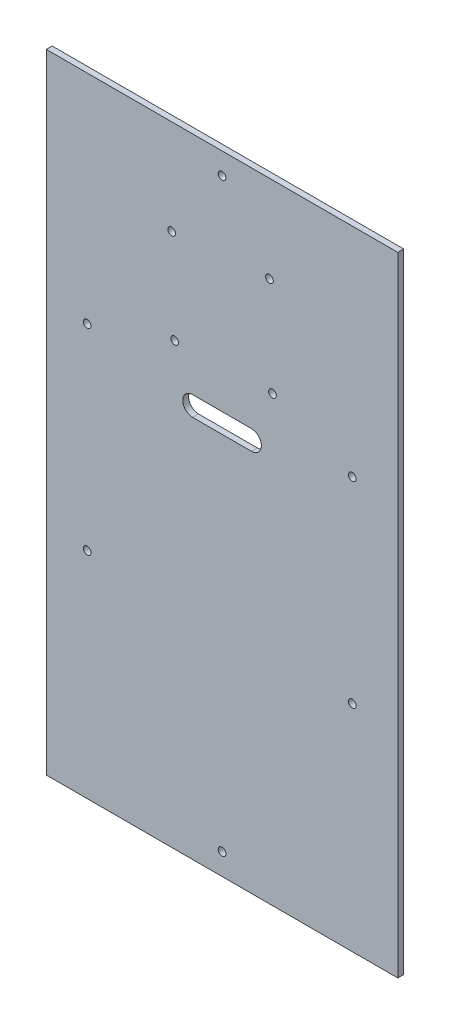
ISO-10303-21;
HEADER;
FILE_DESCRIPTION(('STEP AP214'),'2;1');
FILE_NAME('part.step','',(''),(''),'','','');
FILE_SCHEMA(('AUTOMOTIVE_DESIGN { 1 0 10303 214 1 1 1 1 }'));
ENDSEC;
DATA;
#1=APPLICATION_CONTEXT('core data for automotive mechanical design processes');
#2=APPLICATION_PROTOCOL_DEFINITION('international standard','automotive_design',2000,#1);
#3=PRODUCT_CONTEXT('',#1,'mechanical');
#4=PRODUCT('Part','Part','',(#3));
#5=PRODUCT_RELATED_PRODUCT_CATEGORY('part','',(#4));
#6=PRODUCT_DEFINITION_FORMATION('','',#4);
#7=PRODUCT_DEFINITION_CONTEXT('part definition',#1,'design');
#8=PRODUCT_DEFINITION('design','',#6,#7);
#9=PRODUCT_DEFINITION_SHAPE('','',#8);
#10=(LENGTH_UNIT() NAMED_UNIT(*) SI_UNIT(.MILLI.,.METRE.));
#11=(NAMED_UNIT(*) PLANE_ANGLE_UNIT() SI_UNIT($,.RADIAN.));
#12=(NAMED_UNIT(*) SI_UNIT($,.STERADIAN.) SOLID_ANGLE_UNIT());
#13=UNCERTAINTY_MEASURE_WITH_UNIT(LENGTH_MEASURE(1.E-05),#10,'distance_accuracy_value','');
#14=(GEOMETRIC_REPRESENTATION_CONTEXT(3) GLOBAL_UNCERTAINTY_ASSIGNED_CONTEXT((#13)) GLOBAL_UNIT_ASSIGNED_CONTEXT((#10,
#11,#12)) REPRESENTATION_CONTEXT('',''));
#15=CARTESIAN_POINT('',(0.,0.,0.));
#16=DIRECTION('',(0.,0.,1.));
#17=DIRECTION('',(1.,0.,0.));
#18=AXIS2_PLACEMENT_3D('',#15,#16,#17);
#19=CARTESIAN_POINT('',(-89.5,160.,3.));
#20=DIRECTION('',(1.,0.,0.));
#21=DIRECTION('',(0.,1.,0.));
#22=AXIS2_PLACEMENT_3D('',#19,#20,#21);
#23=PLANE('',#22);
#24=DIRECTION('',(0.,-1.,0.));
#25=VECTOR('',#24,1.);
#26=CARTESIAN_POINT('',(-89.5,160.,0.));
#27=LINE('',#26,#25);
#28=CARTESIAN_POINT('',(-89.5,160.,0.));
#29=VERTEX_POINT('',#28);
#30=CARTESIAN_POINT('',(-89.5,-160.,0.));
#31=VERTEX_POINT('',#30);
#32=EDGE_CURVE('E174',#29,#31,#27,.T.);
#33=ORIENTED_EDGE('',*,*,#32,.T.);
#34=DIRECTION('',(0.,0.,-1.));
#35=VECTOR('',#34,1.);
#36=CARTESIAN_POINT('',(-89.5,-160.,3.));
#37=LINE('',#36,#35);
#38=CARTESIAN_POINT('',(-89.5,-160.,3.));
#39=VERTEX_POINT('',#38);
#40=EDGE_CURVE('E11',#39,#31,#37,.T.);
#41=ORIENTED_EDGE('',*,*,#40,.F.);
#42=DIRECTION('',(0.,-1.,0.));
#43=VECTOR('',#42,1.);
#44=CARTESIAN_POINT('',(-89.5,160.,3.));
#45=LINE('',#44,#43);
#46=CARTESIAN_POINT('',(-89.5,160.,3.));
#47=VERTEX_POINT('',#46);
#48=EDGE_CURVE('E175',#47,#39,#45,.T.);
#49=ORIENTED_EDGE('',*,*,#48,.F.);
#50=DIRECTION('',(0.,0.,-1.));
#51=VECTOR('',#50,1.);
#52=CARTESIAN_POINT('',(-89.5,160.,3.));
#53=LINE('',#52,#51);
#54=EDGE_CURVE('E185',#47,#29,#53,.T.);
#55=ORIENTED_EDGE('',*,*,#54,.T.);
#56=EDGE_LOOP('',(#33,#41,#49,#55));
#57=FACE_BOUND('',#56,.T.);
#58=ADVANCED_FACE('F35',(#57),#23,.F.);
#59=CARTESIAN_POINT('',(-89.5,-160.,3.));
#60=DIRECTION('',(0.,1.,0.));
#61=DIRECTION('',(0.,0.,1.));
#62=AXIS2_PLACEMENT_3D('',#59,#60,#61);
#63=PLANE('',#62);
#64=DIRECTION('',(1.,0.,0.));
#65=VECTOR('',#64,1.);
#66=CARTESIAN_POINT('',(-89.5,-160.,0.));
#67=LINE('',#66,#65);
#68=CARTESIAN_POINT('',(89.5,-160.,0.));
#69=VERTEX_POINT('',#68);
#70=EDGE_CURVE('E188',#31,#69,#67,.T.);
#71=ORIENTED_EDGE('',*,*,#70,.T.);
#72=DIRECTION('',(0.,0.,-1.));
#73=VECTOR('',#72,1.);
#74=CARTESIAN_POINT('',(89.5,-160.,3.));
#75=LINE('',#74,#73);
#76=CARTESIAN_POINT('',(89.5,-160.,3.));
#77=VERTEX_POINT('',#76);
#78=EDGE_CURVE('E42',#77,#69,#75,.T.);
#79=ORIENTED_EDGE('',*,*,#78,.F.);
#80=DIRECTION('',(1.,0.,0.));
#81=VECTOR('',#80,1.);
#82=CARTESIAN_POINT('',(-89.5,-160.,3.));
#83=LINE('',#82,#81);
#84=EDGE_CURVE('E178',#39,#77,#83,.T.);
#85=ORIENTED_EDGE('',*,*,#84,.F.);
#86=ORIENTED_EDGE('',*,*,#40,.T.);
#87=EDGE_LOOP('',(#71,#79,#85,#86));
#88=FACE_BOUND('',#87,.T.);
#89=ADVANCED_FACE('F217',(#88),#63,.F.);
#90=CARTESIAN_POINT('',(89.5,160.,3.));
#91=DIRECTION('',(-1.,0.,0.));
#92=DIRECTION('',(0.,-1.,0.));
#93=AXIS2_PLACEMENT_3D('',#90,#91,#92);
#94=PLANE('',#93);
#95=DIRECTION('',(0.,1.,0.));
#96=VECTOR('',#95,1.);
#97=CARTESIAN_POINT('',(89.5,160.,0.));
#98=LINE('',#97,#96);
#99=CARTESIAN_POINT('',(89.5,160.,0.));
#100=VERTEX_POINT('',#99);
#101=EDGE_CURVE('E190',#69,#100,#98,.T.);
#102=ORIENTED_EDGE('',*,*,#101,.T.);
#103=DIRECTION('',(0.,0.,-1.));
#104=VECTOR('',#103,1.);
#105=CARTESIAN_POINT('',(89.5,160.,3.));
#106=LINE('',#105,#104);
#107=CARTESIAN_POINT('',(89.5,160.,3.));
#108=VERTEX_POINT('',#107);
#109=EDGE_CURVE('E195',#108,#100,#106,.T.);
#110=ORIENTED_EDGE('',*,*,#109,.F.);
#111=DIRECTION('',(0.,1.,0.));
#112=VECTOR('',#111,1.);
#113=CARTESIAN_POINT('',(89.5,160.,3.));
#114=LINE('',#113,#112);
#115=EDGE_CURVE('E181',#77,#108,#114,.T.);
#116=ORIENTED_EDGE('',*,*,#115,.F.);
#117=ORIENTED_EDGE('',*,*,#78,.T.);
#118=EDGE_LOOP('',(#102,#110,#116,#117));
#119=FACE_BOUND('',#118,.T.);
#120=ADVANCED_FACE('F202',(#119),#94,.F.);
#121=CARTESIAN_POINT('',(-89.5,160.,3.));
#122=DIRECTION('',(0.,-1.,0.));
#123=DIRECTION('',(0.,0.,-1.));
#124=AXIS2_PLACEMENT_3D('',#121,#122,#123);
#125=PLANE('',#124);
#126=DIRECTION('',(-1.,0.,0.));
#127=VECTOR('',#126,1.);
#128=CARTESIAN_POINT('',(-89.5,160.,0.));
#129=LINE('',#128,#127);
#130=EDGE_CURVE('E179',#100,#29,#129,.T.);
#131=ORIENTED_EDGE('',*,*,#130,.T.);
#132=ORIENTED_EDGE('',*,*,#54,.F.);
#133=DIRECTION('',(-1.,0.,0.));
#134=VECTOR('',#133,1.);
#135=CARTESIAN_POINT('',(-89.5,160.,3.));
#136=LINE('',#135,#134);
#137=EDGE_CURVE('E183',#108,#47,#136,.T.);
#138=ORIENTED_EDGE('',*,*,#137,.F.);
#139=ORIENTED_EDGE('',*,*,#109,.T.);
#140=EDGE_LOOP('',(#131,#132,#138,#139));
#141=FACE_BOUND('',#140,.T.);
#142=ADVANCED_FACE('F210',(#141),#125,.F.);
#143=CARTESIAN_POINT('',(0.,0.,3.));
#144=DIRECTION('',(0.,0.,1.));
#145=DIRECTION('',(1.,0.,0.));
#146=AXIS2_PLACEMENT_3D('',#143,#144,#145);
#147=PLANE('',#146);
#148=CARTESIAN_POINT('',(-24.1541113062931,64.3179863791884,3.));
#149=DIRECTION('',(0.,0.,1.));
#150=DIRECTION('',(1.,0.,0.));
#151=AXIS2_PLACEMENT_3D('',#148,#149,#150);
#152=CIRCLE('',#151,1.94999999999999);
#153=CARTESIAN_POINT('',(-22.2041113062931,64.3179863791884,3.));
#154=VERTEX_POINT('',#153);
#155=EDGE_CURVE('E291',#154,#154,#152,.T.);
#156=ORIENTED_EDGE('',*,*,#155,.F.);
#157=EDGE_LOOP('',(#156));
#158=FACE_BOUND('',#157,.T.);
#159=CARTESIAN_POINT('',(25.6736027414732,65.8424248902623,3.));
#160=DIRECTION('',(0.,0.,1.));
#161=DIRECTION('',(1.,0.,0.));
#162=AXIS2_PLACEMENT_3D('',#159,#160,#161);
#163=CIRCLE('',#162,1.94999999999999);
#164=CARTESIAN_POINT('',(27.6236027414731,65.8424248902623,3.));
#165=VERTEX_POINT('',#164);
#166=EDGE_CURVE('E293',#165,#165,#163,.T.);
#167=ORIENTED_EDGE('',*,*,#166,.F.);
#168=EDGE_LOOP('',(#167));
#169=FACE_BOUND('',#168,.T.);
#170=CARTESIAN_POINT('',(24.1491642303993,115.670138938028,3.));
#171=DIRECTION('',(0.,0.,1.));
#172=DIRECTION('',(1.,0.,0.));
#173=AXIS2_PLACEMENT_3D('',#170,#171,#172);
#174=CIRCLE('',#173,1.94999999999999);
#175=CARTESIAN_POINT('',(26.0991642303993,115.670138938028,3.));
#176=VERTEX_POINT('',#175);
#177=EDGE_CURVE('E301',#176,#176,#174,.T.);
#178=ORIENTED_EDGE('',*,*,#177,.F.);
#179=EDGE_LOOP('',(#178));
#180=FACE_BOUND('',#179,.T.);
#181=CARTESIAN_POINT('',(-25.6234074167878,111.665831379753,3.));
#182=DIRECTION('',(0.,0.,1.));
#183=DIRECTION('',(1.,0.,0.));
#184=AXIS2_PLACEMENT_3D('',#181,#182,#183);
#185=CIRCLE('',#184,1.94999999999999);
#186=CARTESIAN_POINT('',(-23.6734074167878,111.665831379753,3.));
#187=VERTEX_POINT('',#186);
#188=EDGE_CURVE('E306',#187,#187,#185,.T.);
#189=ORIENTED_EDGE('',*,*,#188,.F.);
#190=EDGE_LOOP('',(#189));
#191=FACE_BOUND('',#190,.T.);
#192=CARTESIAN_POINT('',(-15.,40.,3.));
#193=DIRECTION('',(0.,0.,1.));
#194=DIRECTION('',(1.,0.,0.));
#195=AXIS2_PLACEMENT_3D('',#192,#193,#194);
#196=CIRCLE('',#195,5.);
#197=CARTESIAN_POINT('',(-15.,45.,3.));
#198=VERTEX_POINT('',#197);
#199=CARTESIAN_POINT('',(-15.,35.,3.));
#200=VERTEX_POINT('',#199);
#201=EDGE_CURVE('E49',#198,#200,#196,.T.);
#202=ORIENTED_EDGE('',*,*,#201,.F.);
#203=DIRECTION('',(-1.,0.,0.));
#204=VECTOR('',#203,1.);
#205=CARTESIAN_POINT('',(-15.,45.,3.));
#206=LINE('',#205,#204);
#207=CARTESIAN_POINT('',(15.,45.,3.));
#208=VERTEX_POINT('',#207);
#209=EDGE_CURVE('E117',#208,#198,#206,.T.);
#210=ORIENTED_EDGE('',*,*,#209,.F.);
#211=CARTESIAN_POINT('',(15.,40.,3.));
#212=DIRECTION('',(0.,0.,1.));
#213=DIRECTION('',(1.,0.,0.));
#214=AXIS2_PLACEMENT_3D('',#211,#212,#213);
#215=CIRCLE('',#214,5.);
#216=CARTESIAN_POINT('',(15.,35.,3.));
#217=VERTEX_POINT('',#216);
#218=EDGE_CURVE('E120',#217,#208,#215,.T.);
#219=ORIENTED_EDGE('',*,*,#218,.F.);
#220=DIRECTION('',(1.,0.,0.));
#221=VECTOR('',#220,1.);
#222=CARTESIAN_POINT('',(-15.,35.,3.));
#223=LINE('',#222,#221);
#224=EDGE_CURVE('E129',#200,#217,#223,.T.);
#225=ORIENTED_EDGE('',*,*,#224,.F.);
#226=EDGE_LOOP('',(#202,#210,#219,#225));
#227=FACE_BOUND('',#226,.T.);
#228=CARTESIAN_POINT('',(0.,149.,3.));
#229=DIRECTION('',(0.,0.,1.));
#230=DIRECTION('',(1.,0.,0.));
#231=AXIS2_PLACEMENT_3D('',#228,#229,#230);
#232=CIRCLE('',#231,1.94999999999999);
#233=CARTESIAN_POINT('',(1.94999999999996,149.,3.));
#234=VERTEX_POINT('',#233);
#235=EDGE_CURVE('E135',#234,#234,#232,.T.);
#236=ORIENTED_EDGE('',*,*,#235,.F.);
#237=EDGE_LOOP('',(#236));
#238=FACE_BOUND('',#237,.T.);
#239=CARTESIAN_POINT('',(-68.6899999999997,49.4199999999995,3.));
#240=DIRECTION('',(0.,0.,1.));
#241=DIRECTION('',(1.,0.,0.));
#242=AXIS2_PLACEMENT_3D('',#239,#240,#241);
#243=CIRCLE('',#242,1.94999999999999);
#244=CARTESIAN_POINT('',(-66.7399999999997,49.4199999999995,3.));
#245=VERTEX_POINT('',#244);
#246=EDGE_CURVE('E144',#245,#245,#243,.T.);
#247=ORIENTED_EDGE('',*,*,#246,.F.);
#248=EDGE_LOOP('',(#247));
#249=FACE_BOUND('',#248,.T.);
#250=CARTESIAN_POINT('',(66.31,49.4200000000004,3.));
#251=DIRECTION('',(0.,0.,1.));
#252=DIRECTION('',(1.,0.,0.));
#253=AXIS2_PLACEMENT_3D('',#250,#251,#252);
#254=CIRCLE('',#253,1.94999999999999);
#255=CARTESIAN_POINT('',(68.26,49.4200000000004,3.));
#256=VERTEX_POINT('',#255);
#257=EDGE_CURVE('E150',#256,#256,#254,.T.);
#258=ORIENTED_EDGE('',*,*,#257,.F.);
#259=EDGE_LOOP('',(#258));
#260=FACE_BOUND('',#259,.T.);
#261=CARTESIAN_POINT('',(-68.6899999999987,-50.580000000001,3.));
#262=DIRECTION('',(0.,0.,1.));
#263=DIRECTION('',(1.,0.,0.));
#264=AXIS2_PLACEMENT_3D('',#261,#262,#263);
#265=CIRCLE('',#264,1.94999999999999);
#266=CARTESIAN_POINT('',(-66.7399999999987,-50.580000000001,3.));
#267=VERTEX_POINT('',#266);
#268=EDGE_CURVE('E156',#267,#267,#265,.T.);
#269=ORIENTED_EDGE('',*,*,#268,.F.);
#270=EDGE_LOOP('',(#269));
#271=FACE_BOUND('',#270,.T.);
#272=CARTESIAN_POINT('',(0.,-149.,3.));
#273=DIRECTION('',(0.,0.,1.));
#274=DIRECTION('',(1.,0.,0.));
#275=AXIS2_PLACEMENT_3D('',#272,#273,#274);
#276=CIRCLE('',#275,1.94999999999999);
#277=CARTESIAN_POINT('',(1.94999999999996,-149.,3.));
#278=VERTEX_POINT('',#277);
#279=EDGE_CURVE('E162',#278,#278,#276,.T.);
#280=ORIENTED_EDGE('',*,*,#279,.F.);
#281=EDGE_LOOP('',(#280));
#282=FACE_BOUND('',#281,.T.);
#283=CARTESIAN_POINT('',(66.310000000001,-50.58,3.));
#284=DIRECTION('',(0.,0.,1.));
#285=DIRECTION('',(1.,0.,0.));
#286=AXIS2_PLACEMENT_3D('',#283,#284,#285);
#287=CIRCLE('',#286,1.94999999999999);
#288=CARTESIAN_POINT('',(68.260000000001,-50.58,3.));
#289=VERTEX_POINT('',#288);
#290=EDGE_CURVE('E168',#289,#289,#287,.T.);
#291=ORIENTED_EDGE('',*,*,#290,.F.);
#292=EDGE_LOOP('',(#291));
#293=FACE_BOUND('',#292,.T.);
#294=ORIENTED_EDGE('',*,*,#48,.T.);
#295=ORIENTED_EDGE('',*,*,#84,.T.);
#296=ORIENTED_EDGE('',*,*,#115,.T.);
#297=ORIENTED_EDGE('',*,*,#137,.T.);
#298=EDGE_LOOP('',(#294,#295,#296,#297));
#299=FACE_BOUND('',#298,.T.);
#300=ADVANCED_FACE('F216',(#158,#169,#180,#191,#227,#238,#249,#260,#271,#282,#293,#299),#147,.T.);
#301=CARTESIAN_POINT('',(0.,0.,0.));
#302=DIRECTION('',(0.,0.,1.));
#303=DIRECTION('',(1.,0.,0.));
#304=AXIS2_PLACEMENT_3D('',#301,#302,#303);
#305=PLANE('',#304);
#306=CARTESIAN_POINT('',(-24.1541113062931,64.3179863791884,0.));
#307=DIRECTION('',(0.,0.,1.));
#308=DIRECTION('',(1.,0.,0.));
#309=AXIS2_PLACEMENT_3D('',#306,#307,#308);
#310=CIRCLE('',#309,1.94999999999999);
#311=CARTESIAN_POINT('',(-22.2041113062931,64.3179863791884,0.));
#312=VERTEX_POINT('',#311);
#313=EDGE_CURVE('E288',#312,#312,#310,.T.);
#314=ORIENTED_EDGE('',*,*,#313,.T.);
#315=EDGE_LOOP('',(#314));
#316=FACE_BOUND('',#315,.T.);
#317=CARTESIAN_POINT('',(25.6736027414732,65.8424248902623,0.));
#318=DIRECTION('',(0.,0.,1.));
#319=DIRECTION('',(1.,0.,0.));
#320=AXIS2_PLACEMENT_3D('',#317,#318,#319);
#321=CIRCLE('',#320,1.94999999999999);
#322=CARTESIAN_POINT('',(27.6236027414731,65.8424248902623,0.));
#323=VERTEX_POINT('',#322);
#324=EDGE_CURVE('E298',#323,#323,#321,.T.);
#325=ORIENTED_EDGE('',*,*,#324,.T.);
#326=EDGE_LOOP('',(#325));
#327=FACE_BOUND('',#326,.T.);
#328=CARTESIAN_POINT('',(24.1491642303993,115.670138938028,0.));
#329=DIRECTION('',(0.,0.,1.));
#330=DIRECTION('',(1.,0.,0.));
#331=AXIS2_PLACEMENT_3D('',#328,#329,#330);
#332=CIRCLE('',#331,1.94999999999999);
#333=CARTESIAN_POINT('',(26.0991642303993,115.670138938028,0.));
#334=VERTEX_POINT('',#333);
#335=EDGE_CURVE('E304',#334,#334,#332,.T.);
#336=ORIENTED_EDGE('',*,*,#335,.T.);
#337=EDGE_LOOP('',(#336));
#338=FACE_BOUND('',#337,.T.);
#339=CARTESIAN_POINT('',(-25.6234074167878,111.665831379753,0.));
#340=DIRECTION('',(0.,0.,1.));
#341=DIRECTION('',(1.,0.,0.));
#342=AXIS2_PLACEMENT_3D('',#339,#340,#341);
#343=CIRCLE('',#342,1.94999999999999);
#344=CARTESIAN_POINT('',(-23.6734074167878,111.665831379753,0.));
#345=VERTEX_POINT('',#344);
#346=EDGE_CURVE('E123',#345,#345,#343,.T.);
#347=ORIENTED_EDGE('',*,*,#346,.T.);
#348=EDGE_LOOP('',(#347));
#349=FACE_BOUND('',#348,.T.);
#350=DIRECTION('',(-1.,0.,0.));
#351=VECTOR('',#350,1.);
#352=CARTESIAN_POINT('',(-15.,45.,0.));
#353=LINE('',#352,#351);
#354=CARTESIAN_POINT('',(15.,45.,0.));
#355=VERTEX_POINT('',#354);
#356=CARTESIAN_POINT('',(-15.,45.,0.));
#357=VERTEX_POINT('',#356);
#358=EDGE_CURVE('E107',#355,#357,#353,.T.);
#359=ORIENTED_EDGE('',*,*,#358,.T.);
#360=CARTESIAN_POINT('',(-15.,40.,0.));
#361=DIRECTION('',(0.,0.,1.));
#362=DIRECTION('',(1.,0.,0.));
#363=AXIS2_PLACEMENT_3D('',#360,#361,#362);
#364=CIRCLE('',#363,5.);
#365=CARTESIAN_POINT('',(-15.,35.,0.));
#366=VERTEX_POINT('',#365);
#367=EDGE_CURVE('E101',#357,#366,#364,.T.);
#368=ORIENTED_EDGE('',*,*,#367,.T.);
#369=DIRECTION('',(1.,0.,0.));
#370=VECTOR('',#369,1.);
#371=CARTESIAN_POINT('',(-15.,35.,0.));
#372=LINE('',#371,#370);
#373=CARTESIAN_POINT('',(15.,35.,0.));
#374=VERTEX_POINT('',#373);
#375=EDGE_CURVE('E110',#366,#374,#372,.T.);
#376=ORIENTED_EDGE('',*,*,#375,.T.);
#377=CARTESIAN_POINT('',(15.,40.,0.));
#378=DIRECTION('',(0.,0.,1.));
#379=DIRECTION('',(1.,0.,0.));
#380=AXIS2_PLACEMENT_3D('',#377,#378,#379);
#381=CIRCLE('',#380,5.);
#382=EDGE_CURVE('E57',#374,#355,#381,.T.);
#383=ORIENTED_EDGE('',*,*,#382,.T.);
#384=EDGE_LOOP('',(#359,#368,#376,#383));
#385=FACE_BOUND('',#384,.T.);
#386=CARTESIAN_POINT('',(0.,149.,0.));
#387=DIRECTION('',(0.,0.,1.));
#388=DIRECTION('',(1.,0.,0.));
#389=AXIS2_PLACEMENT_3D('',#386,#387,#388);
#390=CIRCLE('',#389,1.94999999999999);
#391=CARTESIAN_POINT('',(1.94999999999996,149.,0.));
#392=VERTEX_POINT('',#391);
#393=EDGE_CURVE('E141',#392,#392,#390,.T.);
#394=ORIENTED_EDGE('',*,*,#393,.T.);
#395=EDGE_LOOP('',(#394));
#396=FACE_BOUND('',#395,.T.);
#397=CARTESIAN_POINT('',(-68.6899999999997,49.4199999999995,0.));
#398=DIRECTION('',(0.,0.,1.));
#399=DIRECTION('',(1.,0.,0.));
#400=AXIS2_PLACEMENT_3D('',#397,#398,#399);
#401=CIRCLE('',#400,1.94999999999999);
#402=CARTESIAN_POINT('',(-66.7399999999997,49.4199999999995,0.));
#403=VERTEX_POINT('',#402);
#404=EDGE_CURVE('E147',#403,#403,#401,.T.);
#405=ORIENTED_EDGE('',*,*,#404,.T.);
#406=EDGE_LOOP('',(#405));
#407=FACE_BOUND('',#406,.T.);
#408=CARTESIAN_POINT('',(66.31,49.4200000000004,0.));
#409=DIRECTION('',(0.,0.,1.));
#410=DIRECTION('',(1.,0.,0.));
#411=AXIS2_PLACEMENT_3D('',#408,#409,#410);
#412=CIRCLE('',#411,1.94999999999999);
#413=CARTESIAN_POINT('',(68.26,49.4200000000004,0.));
#414=VERTEX_POINT('',#413);
#415=EDGE_CURVE('E153',#414,#414,#412,.T.);
#416=ORIENTED_EDGE('',*,*,#415,.T.);
#417=EDGE_LOOP('',(#416));
#418=FACE_BOUND('',#417,.T.);
#419=CARTESIAN_POINT('',(-68.6899999999987,-50.580000000001,0.));
#420=DIRECTION('',(0.,0.,1.));
#421=DIRECTION('',(1.,0.,0.));
#422=AXIS2_PLACEMENT_3D('',#419,#420,#421);
#423=CIRCLE('',#422,1.94999999999999);
#424=CARTESIAN_POINT('',(-66.7399999999987,-50.580000000001,0.));
#425=VERTEX_POINT('',#424);
#426=EDGE_CURVE('E159',#425,#425,#423,.T.);
#427=ORIENTED_EDGE('',*,*,#426,.T.);
#428=EDGE_LOOP('',(#427));
#429=FACE_BOUND('',#428,.T.);
#430=CARTESIAN_POINT('',(0.,-149.,0.));
#431=DIRECTION('',(0.,0.,1.));
#432=DIRECTION('',(1.,0.,0.));
#433=AXIS2_PLACEMENT_3D('',#430,#431,#432);
#434=CIRCLE('',#433,1.94999999999999);
#435=CARTESIAN_POINT('',(1.94999999999996,-149.,0.));
#436=VERTEX_POINT('',#435);
#437=EDGE_CURVE('E165',#436,#436,#434,.T.);
#438=ORIENTED_EDGE('',*,*,#437,.T.);
#439=EDGE_LOOP('',(#438));
#440=FACE_BOUND('',#439,.T.);
#441=CARTESIAN_POINT('',(66.310000000001,-50.58,0.));
#442=DIRECTION('',(0.,0.,1.));
#443=DIRECTION('',(1.,0.,0.));
#444=AXIS2_PLACEMENT_3D('',#441,#442,#443);
#445=CIRCLE('',#444,1.94999999999999);
#446=CARTESIAN_POINT('',(68.260000000001,-50.58,0.));
#447=VERTEX_POINT('',#446);
#448=EDGE_CURVE('E171',#447,#447,#445,.T.);
#449=ORIENTED_EDGE('',*,*,#448,.T.);
#450=EDGE_LOOP('',(#449));
#451=FACE_BOUND('',#450,.T.);
#452=ORIENTED_EDGE('',*,*,#32,.F.);
#453=ORIENTED_EDGE('',*,*,#130,.F.);
#454=ORIENTED_EDGE('',*,*,#101,.F.);
#455=ORIENTED_EDGE('',*,*,#70,.F.);
#456=EDGE_LOOP('',(#452,#453,#454,#455));
#457=FACE_BOUND('',#456,.T.);
#458=ADVANCED_FACE('F114',(#316,#327,#338,#349,#385,#396,#407,#418,#429,#440,#451,#457),#305,.F.);
#459=CARTESIAN_POINT('',(66.310000000001,-50.58,3.));
#460=DIRECTION('',(0.,0.,1.));
#461=DIRECTION('',(1.,0.,0.));
#462=AXIS2_PLACEMENT_3D('',#459,#460,#461);
#463=CYLINDRICAL_SURFACE('',#462,1.94999999999999);
#464=ORIENTED_EDGE('',*,*,#448,.F.);
#465=EDGE_LOOP('',(#464));
#466=FACE_BOUND('',#465,.T.);
#467=ORIENTED_EDGE('',*,*,#290,.T.);
#468=EDGE_LOOP('',(#467));
#469=FACE_BOUND('',#468,.T.);
#470=ADVANCED_FACE('F229',(#466,#469),#463,.F.);
#471=CARTESIAN_POINT('',(0.,-149.,3.));
#472=DIRECTION('',(0.,0.,1.));
#473=DIRECTION('',(1.,0.,0.));
#474=AXIS2_PLACEMENT_3D('',#471,#472,#473);
#475=CYLINDRICAL_SURFACE('',#474,1.94999999999999);
#476=ORIENTED_EDGE('',*,*,#437,.F.);
#477=EDGE_LOOP('',(#476));
#478=FACE_BOUND('',#477,.T.);
#479=ORIENTED_EDGE('',*,*,#279,.T.);
#480=EDGE_LOOP('',(#479));
#481=FACE_BOUND('',#480,.T.);
#482=ADVANCED_FACE('F236',(#478,#481),#475,.F.);
#483=CARTESIAN_POINT('',(-68.6899999999987,-50.580000000001,3.));
#484=DIRECTION('',(0.,0.,1.));
#485=DIRECTION('',(1.,0.,0.));
#486=AXIS2_PLACEMENT_3D('',#483,#484,#485);
#487=CYLINDRICAL_SURFACE('',#486,1.94999999999999);
#488=ORIENTED_EDGE('',*,*,#426,.F.);
#489=EDGE_LOOP('',(#488));
#490=FACE_BOUND('',#489,.T.);
#491=ORIENTED_EDGE('',*,*,#268,.T.);
#492=EDGE_LOOP('',(#491));
#493=FACE_BOUND('',#492,.T.);
#494=ADVANCED_FACE('F240',(#490,#493),#487,.F.);
#495=CARTESIAN_POINT('',(66.31,49.4200000000004,3.));
#496=DIRECTION('',(0.,0.,1.));
#497=DIRECTION('',(1.,0.,0.));
#498=AXIS2_PLACEMENT_3D('',#495,#496,#497);
#499=CYLINDRICAL_SURFACE('',#498,1.94999999999999);
#500=ORIENTED_EDGE('',*,*,#415,.F.);
#501=EDGE_LOOP('',(#500));
#502=FACE_BOUND('',#501,.T.);
#503=ORIENTED_EDGE('',*,*,#257,.T.);
#504=EDGE_LOOP('',(#503));
#505=FACE_BOUND('',#504,.T.);
#506=ADVANCED_FACE('F244',(#502,#505),#499,.F.);
#507=CARTESIAN_POINT('',(-68.6899999999997,49.4199999999995,3.));
#508=DIRECTION('',(0.,0.,1.));
#509=DIRECTION('',(1.,0.,0.));
#510=AXIS2_PLACEMENT_3D('',#507,#508,#509);
#511=CYLINDRICAL_SURFACE('',#510,1.94999999999999);
#512=ORIENTED_EDGE('',*,*,#404,.F.);
#513=EDGE_LOOP('',(#512));
#514=FACE_BOUND('',#513,.T.);
#515=ORIENTED_EDGE('',*,*,#246,.T.);
#516=EDGE_LOOP('',(#515));
#517=FACE_BOUND('',#516,.T.);
#518=ADVANCED_FACE('F248',(#514,#517),#511,.F.);
#519=CARTESIAN_POINT('',(0.,149.,3.));
#520=DIRECTION('',(0.,0.,1.));
#521=DIRECTION('',(1.,0.,0.));
#522=AXIS2_PLACEMENT_3D('',#519,#520,#521);
#523=CYLINDRICAL_SURFACE('',#522,1.94999999999999);
#524=ORIENTED_EDGE('',*,*,#393,.F.);
#525=EDGE_LOOP('',(#524));
#526=FACE_BOUND('',#525,.T.);
#527=ORIENTED_EDGE('',*,*,#235,.T.);
#528=EDGE_LOOP('',(#527));
#529=FACE_BOUND('',#528,.T.);
#530=ADVANCED_FACE('F252',(#526,#529),#523,.F.);
#531=CARTESIAN_POINT('',(-15.,40.,0.));
#532=DIRECTION('',(0.,0.,1.));
#533=DIRECTION('',(1.,0.,0.));
#534=AXIS2_PLACEMENT_3D('',#531,#532,#533);
#535=CYLINDRICAL_SURFACE('',#534,5.);
#536=ORIENTED_EDGE('',*,*,#201,.T.);
#537=DIRECTION('',(0.,0.,1.));
#538=VECTOR('',#537,1.);
#539=CARTESIAN_POINT('',(-15.,35.,0.));
#540=LINE('',#539,#538);
#541=EDGE_CURVE('E97',#366,#200,#540,.T.);
#542=ORIENTED_EDGE('',*,*,#541,.F.);
#543=ORIENTED_EDGE('',*,*,#367,.F.);
#544=DIRECTION('',(0.,0.,1.));
#545=VECTOR('',#544,1.);
#546=CARTESIAN_POINT('',(-15.,45.,0.));
#547=LINE('',#546,#545);
#548=EDGE_CURVE('E133',#357,#198,#547,.T.);
#549=ORIENTED_EDGE('',*,*,#548,.T.);
#550=EDGE_LOOP('',(#536,#542,#543,#549));
#551=FACE_BOUND('',#550,.T.);
#552=ADVANCED_FACE('F99',(#551),#535,.F.);
#553=CARTESIAN_POINT('',(-15.,45.,0.));
#554=DIRECTION('',(0.,1.,0.));
#555=DIRECTION('',(0.,0.,1.));
#556=AXIS2_PLACEMENT_3D('',#553,#554,#555);
#557=PLANE('',#556);
#558=ORIENTED_EDGE('',*,*,#209,.T.);
#559=ORIENTED_EDGE('',*,*,#548,.F.);
#560=ORIENTED_EDGE('',*,*,#358,.F.);
#561=DIRECTION('',(0.,0.,1.));
#562=VECTOR('',#561,1.);
#563=CARTESIAN_POINT('',(15.,45.,0.));
#564=LINE('',#563,#562);
#565=EDGE_CURVE('E136',#355,#208,#564,.T.);
#566=ORIENTED_EDGE('',*,*,#565,.T.);
#567=EDGE_LOOP('',(#558,#559,#560,#566));
#568=FACE_BOUND('',#567,.T.);
#569=ADVANCED_FACE('F259',(#568),#557,.F.);
#570=CARTESIAN_POINT('',(15.,40.,0.));
#571=DIRECTION('',(0.,0.,1.));
#572=DIRECTION('',(1.,0.,0.));
#573=AXIS2_PLACEMENT_3D('',#570,#571,#572);
#574=CYLINDRICAL_SURFACE('',#573,5.);
#575=ORIENTED_EDGE('',*,*,#218,.T.);
#576=ORIENTED_EDGE('',*,*,#565,.F.);
#577=ORIENTED_EDGE('',*,*,#382,.F.);
#578=DIRECTION('',(0.,0.,1.));
#579=VECTOR('',#578,1.);
#580=CARTESIAN_POINT('',(15.,35.,0.));
#581=LINE('',#580,#579);
#582=EDGE_CURVE('E106',#374,#217,#581,.T.);
#583=ORIENTED_EDGE('',*,*,#582,.T.);
#584=EDGE_LOOP('',(#575,#576,#577,#583));
#585=FACE_BOUND('',#584,.T.);
#586=ADVANCED_FACE('F263',(#585),#574,.F.);
#587=CARTESIAN_POINT('',(-15.,35.,0.));
#588=DIRECTION('',(0.,-1.,0.));
#589=DIRECTION('',(0.,0.,-1.));
#590=AXIS2_PLACEMENT_3D('',#587,#588,#589);
#591=PLANE('',#590);
#592=ORIENTED_EDGE('',*,*,#224,.T.);
#593=ORIENTED_EDGE('',*,*,#582,.F.);
#594=ORIENTED_EDGE('',*,*,#375,.F.);
#595=ORIENTED_EDGE('',*,*,#541,.T.);
#596=EDGE_LOOP('',(#592,#593,#594,#595));
#597=FACE_BOUND('',#596,.T.);
#598=ADVANCED_FACE('F111',(#597),#591,.F.);
#599=CARTESIAN_POINT('',(-25.6234074167878,111.665831379753,3.));
#600=DIRECTION('',(0.,0.,1.));
#601=DIRECTION('',(1.,0.,0.));
#602=AXIS2_PLACEMENT_3D('',#599,#600,#601);
#603=CYLINDRICAL_SURFACE('',#602,1.94999999999999);
#604=ORIENTED_EDGE('',*,*,#346,.F.);
#605=EDGE_LOOP('',(#604));
#606=FACE_BOUND('',#605,.T.);
#607=ORIENTED_EDGE('',*,*,#188,.T.);
#608=EDGE_LOOP('',(#607));
#609=FACE_BOUND('',#608,.T.);
#610=ADVANCED_FACE('F262',(#606,#609),#603,.F.);
#611=CARTESIAN_POINT('',(24.1491642303993,115.670138938028,3.));
#612=DIRECTION('',(0.,0.,1.));
#613=DIRECTION('',(1.,0.,0.));
#614=AXIS2_PLACEMENT_3D('',#611,#612,#613);
#615=CYLINDRICAL_SURFACE('',#614,1.94999999999999);
#616=ORIENTED_EDGE('',*,*,#335,.F.);
#617=EDGE_LOOP('',(#616));
#618=FACE_BOUND('',#617,.T.);
#619=ORIENTED_EDGE('',*,*,#177,.T.);
#620=EDGE_LOOP('',(#619));
#621=FACE_BOUND('',#620,.T.);
#622=ADVANCED_FACE('F271',(#618,#621),#615,.F.);
#623=CARTESIAN_POINT('',(25.6736027414732,65.8424248902623,3.));
#624=DIRECTION('',(0.,0.,1.));
#625=DIRECTION('',(1.,0.,0.));
#626=AXIS2_PLACEMENT_3D('',#623,#624,#625);
#627=CYLINDRICAL_SURFACE('',#626,1.94999999999999);
#628=ORIENTED_EDGE('',*,*,#324,.F.);
#629=EDGE_LOOP('',(#628));
#630=FACE_BOUND('',#629,.T.);
#631=ORIENTED_EDGE('',*,*,#166,.T.);
#632=EDGE_LOOP('',(#631));
#633=FACE_BOUND('',#632,.T.);
#634=ADVANCED_FACE('F275',(#630,#633),#627,.F.);
#635=CARTESIAN_POINT('',(-24.1541113062931,64.3179863791884,3.));
#636=DIRECTION('',(0.,0.,1.));
#637=DIRECTION('',(1.,0.,0.));
#638=AXIS2_PLACEMENT_3D('',#635,#636,#637);
#639=CYLINDRICAL_SURFACE('',#638,1.94999999999999);
#640=ORIENTED_EDGE('',*,*,#313,.F.);
#641=EDGE_LOOP('',(#640));
#642=FACE_BOUND('',#641,.T.);
#643=ORIENTED_EDGE('',*,*,#155,.T.);
#644=EDGE_LOOP('',(#643));
#645=FACE_BOUND('',#644,.T.);
#646=ADVANCED_FACE('F279',(#642,#645),#639,.F.);
#647=CLOSED_SHELL('',(#58,#89,#120,#142,#300,#458,#470,#482,#494,#506,#518,#530,#552,#569,#586,
#598,#610,#622,#634,#646));
#648=MANIFOLD_SOLID_BREP('B2',#647);
#649=ADVANCED_BREP_SHAPE_REPRESENTATION('',(#18,#648),#14);
#650=SHAPE_DEFINITION_REPRESENTATION(#9,#649);
ENDSEC;
END-ISO-10303-21;
